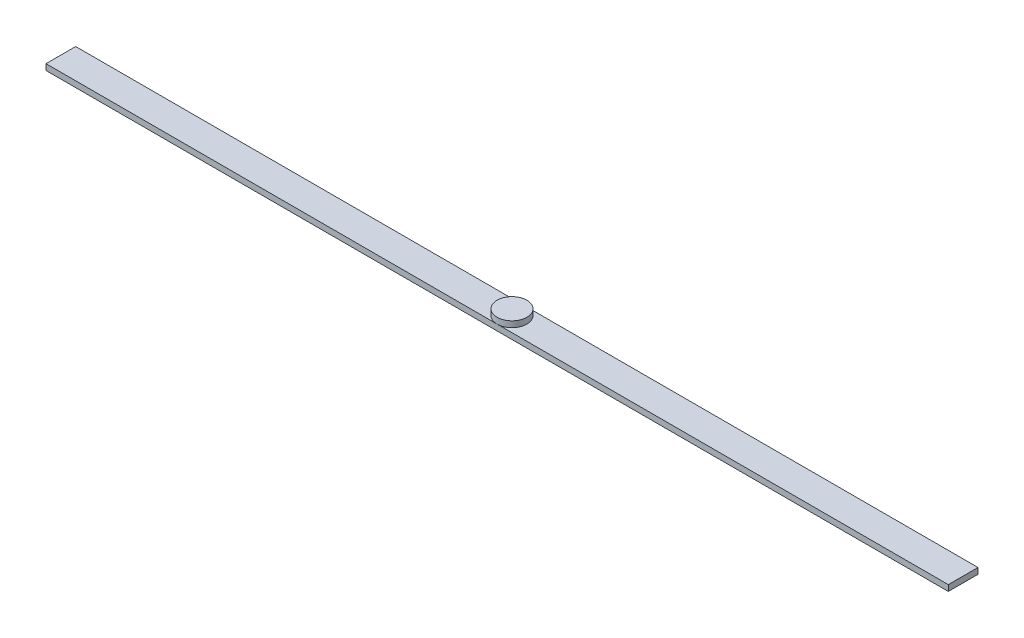
ISO-10303-21;
HEADER;
FILE_DESCRIPTION(('STEP AP214'),'2;1');
FILE_NAME('part.step','',(''),(''),'','','');
FILE_SCHEMA(('AUTOMOTIVE_DESIGN { 1 0 10303 214 1 1 1 1 }'));
ENDSEC;
DATA;
#1=APPLICATION_CONTEXT('core data for automotive mechanical design processes');
#2=APPLICATION_PROTOCOL_DEFINITION('international standard','automotive_design',2000,#1);
#3=PRODUCT_CONTEXT('',#1,'mechanical');
#4=PRODUCT('Part','Part','',(#3));
#5=PRODUCT_RELATED_PRODUCT_CATEGORY('part','',(#4));
#6=PRODUCT_DEFINITION_FORMATION('','',#4);
#7=PRODUCT_DEFINITION_CONTEXT('part definition',#1,'design');
#8=PRODUCT_DEFINITION('design','',#6,#7);
#9=PRODUCT_DEFINITION_SHAPE('','',#8);
#10=(LENGTH_UNIT() NAMED_UNIT(*) SI_UNIT(.MILLI.,.METRE.));
#11=(NAMED_UNIT(*) PLANE_ANGLE_UNIT() SI_UNIT($,.RADIAN.));
#12=(NAMED_UNIT(*) SI_UNIT($,.STERADIAN.) SOLID_ANGLE_UNIT());
#13=UNCERTAINTY_MEASURE_WITH_UNIT(LENGTH_MEASURE(1.E-05),#10,'distance_accuracy_value','');
#14=(GEOMETRIC_REPRESENTATION_CONTEXT(3) GLOBAL_UNCERTAINTY_ASSIGNED_CONTEXT((#13)) GLOBAL_UNIT_ASSIGNED_CONTEXT((#10,
#11,#12)) REPRESENTATION_CONTEXT('',''));
#15=CARTESIAN_POINT('',(0.,0.,0.));
#16=DIRECTION('',(0.,0.,1.));
#17=DIRECTION('',(1.,0.,0.));
#18=AXIS2_PLACEMENT_3D('',#15,#16,#17);
#19=CARTESIAN_POINT('',(0.,2.,0.));
#20=DIRECTION('',(0.,-1.,0.));
#21=DIRECTION('',(0.,0.,-1.));
#22=AXIS2_PLACEMENT_3D('',#19,#20,#21);
#23=PLANE('',#22);
#24=CARTESIAN_POINT('',(0.,2.,0.));
#25=DIRECTION('',(0.,1.,0.));
#26=DIRECTION('',(0.,0.,1.));
#27=AXIS2_PLACEMENT_3D('',#24,#25,#26);
#28=CIRCLE('',#27,5.);
#29=CARTESIAN_POINT('',(0.,2.,5.));
#30=VERTEX_POINT('',#29);
#31=CARTESIAN_POINT('',(0.,2.,-5.));
#32=VERTEX_POINT('',#31);
#33=EDGE_CURVE('E56',#30,#32,#28,.T.);
#34=ORIENTED_EDGE('',*,*,#33,.F.);
#35=DIRECTION('',(1.,0.,0.));
#36=VECTOR('',#35,1.);
#37=CARTESIAN_POINT('',(-152.,2.,5.));
#38=LINE('',#37,#36);
#39=CARTESIAN_POINT('',(152.,2.,5.));
#40=VERTEX_POINT('',#39);
#41=EDGE_CURVE('E70',#30,#40,#38,.T.);
#42=ORIENTED_EDGE('',*,*,#41,.T.);
#43=DIRECTION('',(0.,0.,-1.));
#44=VECTOR('',#43,1.);
#45=CARTESIAN_POINT('',(152.,2.,5.));
#46=LINE('',#45,#44);
#47=CARTESIAN_POINT('',(152.,2.,-5.));
#48=VERTEX_POINT('',#47);
#49=EDGE_CURVE('E170',#40,#48,#46,.T.);
#50=ORIENTED_EDGE('',*,*,#49,.T.);
#51=DIRECTION('',(-1.,0.,0.));
#52=VECTOR('',#51,1.);
#53=CARTESIAN_POINT('',(-152.,2.,-5.));
#54=LINE('',#53,#52);
#55=EDGE_CURVE('E99',#48,#32,#54,.T.);
#56=ORIENTED_EDGE('',*,*,#55,.T.);
#57=EDGE_LOOP('',(#34,#42,#50,#56));
#58=FACE_BOUND('',#57,.T.);
#59=ADVANCED_FACE('F45',(#58),#23,.F.);
#60=CARTESIAN_POINT('',(152.,2.,5.));
#61=DIRECTION('',(-1.,0.,0.));
#62=DIRECTION('',(0.,0.,1.));
#63=AXIS2_PLACEMENT_3D('',#60,#61,#62);
#64=PLANE('',#63);
#65=DIRECTION('',(0.,0.,-1.));
#66=VECTOR('',#65,1.);
#67=CARTESIAN_POINT('',(152.,0.,5.));
#68=LINE('',#67,#66);
#69=CARTESIAN_POINT('',(152.,0.,5.));
#70=VERTEX_POINT('',#69);
#71=CARTESIAN_POINT('',(152.,0.,-5.));
#72=VERTEX_POINT('',#71);
#73=EDGE_CURVE('E163',#70,#72,#68,.T.);
#74=ORIENTED_EDGE('',*,*,#73,.T.);
#75=DIRECTION('',(0.,-1.,0.));
#76=VECTOR('',#75,1.);
#77=CARTESIAN_POINT('',(152.,2.,-5.));
#78=LINE('',#77,#76);
#79=EDGE_CURVE('E49',#48,#72,#78,.T.);
#80=ORIENTED_EDGE('',*,*,#79,.F.);
#81=ORIENTED_EDGE('',*,*,#49,.F.);
#82=DIRECTION('',(0.,-1.,0.));
#83=VECTOR('',#82,1.);
#84=CARTESIAN_POINT('',(152.,2.,5.));
#85=LINE('',#84,#83);
#86=EDGE_CURVE('E108',#40,#70,#85,.T.);
#87=ORIENTED_EDGE('',*,*,#86,.T.);
#88=EDGE_LOOP('',(#74,#80,#81,#87));
#89=FACE_BOUND('',#88,.T.);
#90=ADVANCED_FACE('F47',(#89),#64,.F.);
#91=CARTESIAN_POINT('',(-152.,2.,-5.));
#92=DIRECTION('',(0.,0.,1.));
#93=DIRECTION('',(1.,0.,0.));
#94=AXIS2_PLACEMENT_3D('',#91,#92,#93);
#95=PLANE('',#94);
#96=DIRECTION('',(-1.,0.,0.));
#97=VECTOR('',#96,1.);
#98=CARTESIAN_POINT('',(-152.,0.,-5.));
#99=LINE('',#98,#97);
#100=CARTESIAN_POINT('',(-152.,0.,-5.));
#101=VERTEX_POINT('',#100);
#102=EDGE_CURVE('E154',#72,#101,#99,.T.);
#103=ORIENTED_EDGE('',*,*,#102,.T.);
#104=DIRECTION('',(0.,-1.,0.));
#105=VECTOR('',#104,1.);
#106=CARTESIAN_POINT('',(-152.,2.,-5.));
#107=LINE('',#106,#105);
#108=CARTESIAN_POINT('',(-152.,2.,-5.));
#109=VERTEX_POINT('',#108);
#110=EDGE_CURVE('E156',#109,#101,#107,.T.);
#111=ORIENTED_EDGE('',*,*,#110,.F.);
#112=EDGE_CURVE('E182',#32,#109,#54,.T.);
#113=ORIENTED_EDGE('',*,*,#112,.F.);
#114=ORIENTED_EDGE('',*,*,#55,.F.);
#115=ORIENTED_EDGE('',*,*,#79,.T.);
#116=EDGE_LOOP('',(#103,#111,#113,#114,#115));
#117=FACE_BOUND('',#116,.T.);
#118=ADVANCED_FACE('F139',(#117),#95,.F.);
#119=CARTESIAN_POINT('',(-152.,2.,5.));
#120=DIRECTION('',(1.,0.,0.));
#121=DIRECTION('',(0.,0.,-1.));
#122=AXIS2_PLACEMENT_3D('',#119,#120,#121);
#123=PLANE('',#122);
#124=DIRECTION('',(0.,0.,1.));
#125=VECTOR('',#124,1.);
#126=CARTESIAN_POINT('',(-152.,0.,5.));
#127=LINE('',#126,#125);
#128=CARTESIAN_POINT('',(-152.,0.,5.));
#129=VERTEX_POINT('',#128);
#130=EDGE_CURVE('E162',#101,#129,#127,.T.);
#131=ORIENTED_EDGE('',*,*,#130,.T.);
#132=DIRECTION('',(0.,-1.,0.));
#133=VECTOR('',#132,1.);
#134=CARTESIAN_POINT('',(-152.,2.,5.));
#135=LINE('',#134,#133);
#136=CARTESIAN_POINT('',(-152.,2.,5.));
#137=VERTEX_POINT('',#136);
#138=EDGE_CURVE('E166',#137,#129,#135,.T.);
#139=ORIENTED_EDGE('',*,*,#138,.F.);
#140=DIRECTION('',(0.,0.,1.));
#141=VECTOR('',#140,1.);
#142=CARTESIAN_POINT('',(-152.,2.,5.));
#143=LINE('',#142,#141);
#144=EDGE_CURVE('E105',#109,#137,#143,.T.);
#145=ORIENTED_EDGE('',*,*,#144,.F.);
#146=ORIENTED_EDGE('',*,*,#110,.T.);
#147=EDGE_LOOP('',(#131,#139,#145,#146));
#148=FACE_BOUND('',#147,.T.);
#149=ADVANCED_FACE('F144',(#148),#123,.F.);
#150=CARTESIAN_POINT('',(-152.,2.,5.));
#151=DIRECTION('',(0.,0.,-1.));
#152=DIRECTION('',(-1.,0.,0.));
#153=AXIS2_PLACEMENT_3D('',#150,#151,#152);
#154=PLANE('',#153);
#155=DIRECTION('',(1.,0.,0.));
#156=VECTOR('',#155,1.);
#157=CARTESIAN_POINT('',(-152.,0.,5.));
#158=LINE('',#157,#156);
#159=EDGE_CURVE('E92',#129,#70,#158,.T.);
#160=ORIENTED_EDGE('',*,*,#159,.T.);
#161=ORIENTED_EDGE('',*,*,#86,.F.);
#162=ORIENTED_EDGE('',*,*,#41,.F.);
#163=EDGE_CURVE('E102',#137,#30,#38,.T.);
#164=ORIENTED_EDGE('',*,*,#163,.F.);
#165=ORIENTED_EDGE('',*,*,#138,.T.);
#166=EDGE_LOOP('',(#160,#161,#162,#164,#165));
#167=FACE_BOUND('',#166,.T.);
#168=ADVANCED_FACE('F110',(#167),#154,.F.);
#169=EDGE_CURVE('E11',#32,#30,#28,.T.);
#170=ORIENTED_EDGE('',*,*,#169,.F.);
#171=ORIENTED_EDGE('',*,*,#112,.T.);
#172=ORIENTED_EDGE('',*,*,#144,.T.);
#173=ORIENTED_EDGE('',*,*,#163,.T.);
#174=EDGE_LOOP('',(#170,#171,#172,#173));
#175=FACE_BOUND('',#174,.T.);
#176=ADVANCED_FACE('F103',(#175),#23,.F.);
#177=CARTESIAN_POINT('',(0.,0.,0.));
#178=DIRECTION('',(0.,-1.,0.));
#179=DIRECTION('',(0.,0.,-1.));
#180=AXIS2_PLACEMENT_3D('',#177,#178,#179);
#181=PLANE('',#180);
#182=ORIENTED_EDGE('',*,*,#73,.F.);
#183=ORIENTED_EDGE('',*,*,#159,.F.);
#184=ORIENTED_EDGE('',*,*,#130,.F.);
#185=ORIENTED_EDGE('',*,*,#102,.F.);
#186=EDGE_LOOP('',(#182,#183,#184,#185));
#187=FACE_BOUND('',#186,.T.);
#188=ADVANCED_FACE('F120',(#187),#181,.T.);
#189=CARTESIAN_POINT('',(0.,4.,0.));
#190=DIRECTION('',(0.,-1.,0.));
#191=DIRECTION('',(0.,0.,-1.));
#192=AXIS2_PLACEMENT_3D('',#189,#190,#191);
#193=CYLINDRICAL_SURFACE('',#192,5.);
#194=CARTESIAN_POINT('',(0.,4.,0.));
#195=DIRECTION('',(0.,1.,0.));
#196=DIRECTION('',(0.,0.,1.));
#197=AXIS2_PLACEMENT_3D('',#194,#195,#196);
#198=CIRCLE('',#197,5.);
#199=CARTESIAN_POINT('',(0.,4.,5.));
#200=VERTEX_POINT('',#199);
#201=EDGE_CURVE('E116',#200,#200,#198,.T.);
#202=ORIENTED_EDGE('',*,*,#201,.F.);
#203=EDGE_LOOP('',(#202));
#204=FACE_BOUND('',#203,.T.);
#205=ORIENTED_EDGE('',*,*,#33,.T.);
#206=ORIENTED_EDGE('',*,*,#169,.T.);
#207=EDGE_LOOP('',(#205,#206));
#208=FACE_BOUND('',#207,.T.);
#209=ADVANCED_FACE('F117',(#204,#208),#193,.T.);
#210=CARTESIAN_POINT('',(0.,4.,0.));
#211=DIRECTION('',(0.,1.,0.));
#212=DIRECTION('',(0.,0.,1.));
#213=AXIS2_PLACEMENT_3D('',#210,#211,#212);
#214=PLANE('',#213);
#215=ORIENTED_EDGE('',*,*,#201,.T.);
#216=EDGE_LOOP('',(#215));
#217=FACE_BOUND('',#216,.T.);
#218=ADVANCED_FACE('F119',(#217),#214,.T.);
#219=CLOSED_SHELL('',(#59,#90,#118,#149,#168,#176,#188,#209,#218));
#220=MANIFOLD_SOLID_BREP('B2',#219);
#221=ADVANCED_BREP_SHAPE_REPRESENTATION('',(#18,#220),#14);
#222=SHAPE_DEFINITION_REPRESENTATION(#9,#221);
ENDSEC;
END-ISO-10303-21;
